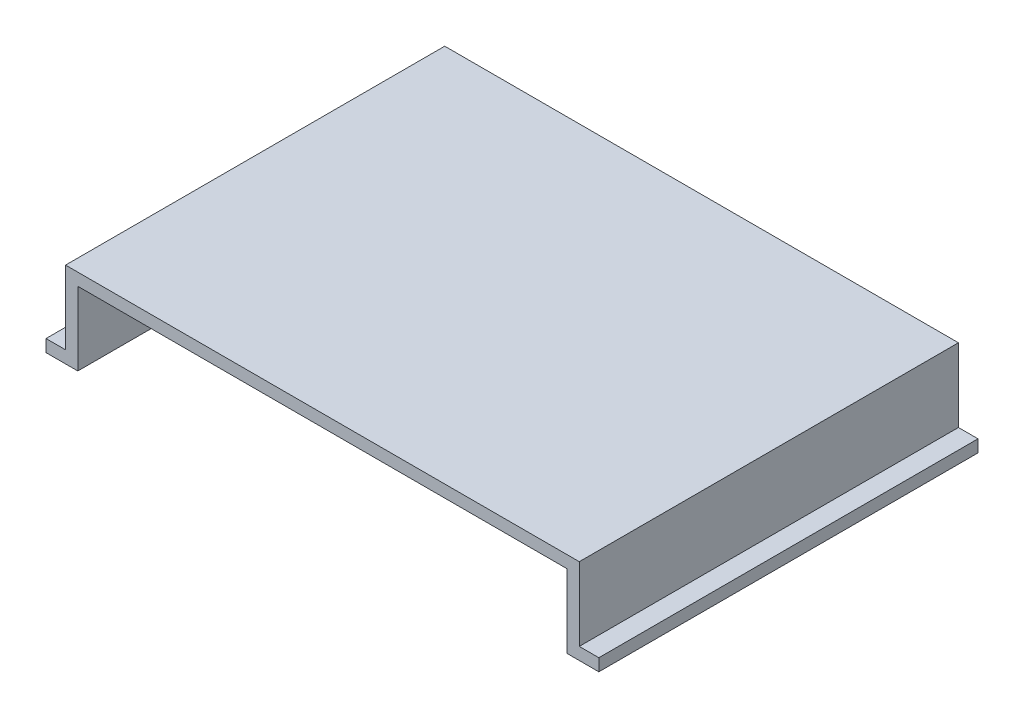
ISO-10303-21;
HEADER;
FILE_DESCRIPTION(('STEP AP214'),'2;1');
FILE_NAME('part.step','',(''),(''),'','','');
FILE_SCHEMA(('AUTOMOTIVE_DESIGN { 1 0 10303 214 1 1 1 1 }'));
ENDSEC;
DATA;
#1=APPLICATION_CONTEXT('core data for automotive mechanical design processes');
#2=APPLICATION_PROTOCOL_DEFINITION('international standard','automotive_design',2000,#1);
#3=PRODUCT_CONTEXT('',#1,'mechanical');
#4=PRODUCT('Part','Part','',(#3));
#5=PRODUCT_RELATED_PRODUCT_CATEGORY('part','',(#4));
#6=PRODUCT_DEFINITION_FORMATION('','',#4);
#7=PRODUCT_DEFINITION_CONTEXT('part definition',#1,'design');
#8=PRODUCT_DEFINITION('design','',#6,#7);
#9=PRODUCT_DEFINITION_SHAPE('','',#8);
#10=(LENGTH_UNIT() NAMED_UNIT(*) SI_UNIT(.MILLI.,.METRE.));
#11=(NAMED_UNIT(*) PLANE_ANGLE_UNIT() SI_UNIT($,.RADIAN.));
#12=(NAMED_UNIT(*) SI_UNIT($,.STERADIAN.) SOLID_ANGLE_UNIT());
#13=UNCERTAINTY_MEASURE_WITH_UNIT(LENGTH_MEASURE(1.E-05),#10,'distance_accuracy_value','');
#14=(GEOMETRIC_REPRESENTATION_CONTEXT(3) GLOBAL_UNCERTAINTY_ASSIGNED_CONTEXT((#13)) GLOBAL_UNIT_ASSIGNED_CONTEXT((#10,
#11,#12)) REPRESENTATION_CONTEXT('',''));
#15=CARTESIAN_POINT('',(0.,0.,0.));
#16=DIRECTION('',(0.,0.,1.));
#17=DIRECTION('',(1.,0.,0.));
#18=AXIS2_PLACEMENT_3D('',#15,#16,#17);
#19=CARTESIAN_POINT('',(0.,5.,150.));
#20=DIRECTION('',(0.,0.,-1.));
#21=DIRECTION('',(-1.,0.,0.));
#22=AXIS2_PLACEMENT_3D('',#19,#20,#21);
#23=PLANE('',#22);
#24=DIRECTION('',(1.,0.,0.));
#25=VECTOR('',#24,1.);
#26=CARTESIAN_POINT('',(0.,0.,150.));
#27=LINE('',#26,#25);
#28=CARTESIAN_POINT('',(0.,0.,150.));
#29=VERTEX_POINT('',#28);
#30=CARTESIAN_POINT('',(200.,0.,150.));
#31=VERTEX_POINT('',#30);
#32=EDGE_CURVE('E257',#29,#31,#27,.T.);
#33=ORIENTED_EDGE('',*,*,#32,.T.);
#34=DIRECTION('',(0.,1.,0.));
#35=VECTOR('',#34,1.);
#36=CARTESIAN_POINT('',(200.,-30.,150.));
#37=LINE('',#36,#35);
#38=CARTESIAN_POINT('',(200.,-30.,150.));
#39=VERTEX_POINT('',#38);
#40=EDGE_CURVE('E243',#39,#31,#37,.T.);
#41=ORIENTED_EDGE('',*,*,#40,.F.);
#42=DIRECTION('',(1.,0.,0.));
#43=VECTOR('',#42,1.);
#44=CARTESIAN_POINT('',(200.,-30.,150.));
#45=LINE('',#44,#43);
#46=CARTESIAN_POINT('',(213.,-30.,150.));
#47=VERTEX_POINT('',#46);
#48=EDGE_CURVE('E143',#39,#47,#45,.T.);
#49=ORIENTED_EDGE('',*,*,#48,.T.);
#50=DIRECTION('',(0.,-1.,0.));
#51=VECTOR('',#50,1.);
#52=CARTESIAN_POINT('',(213.,-30.,150.));
#53=LINE('',#52,#51);
#54=CARTESIAN_POINT('',(213.,-25.,150.));
#55=VERTEX_POINT('',#54);
#56=EDGE_CURVE('E175',#55,#47,#53,.T.);
#57=ORIENTED_EDGE('',*,*,#56,.F.);
#58=DIRECTION('',(-1.,0.,0.));
#59=VECTOR('',#58,1.);
#60=CARTESIAN_POINT('',(213.,-25.,150.));
#61=LINE('',#60,#59);
#62=CARTESIAN_POINT('',(205.,-25.,150.));
#63=VERTEX_POINT('',#62);
#64=EDGE_CURVE('E187',#55,#63,#61,.T.);
#65=ORIENTED_EDGE('',*,*,#64,.T.);
#66=DIRECTION('',(0.,1.,0.));
#67=VECTOR('',#66,1.);
#68=CARTESIAN_POINT('',(205.,-30.,150.));
#69=LINE('',#68,#67);
#70=CARTESIAN_POINT('',(205.,5.,150.));
#71=VERTEX_POINT('',#70);
#72=EDGE_CURVE('E240',#63,#71,#69,.T.);
#73=ORIENTED_EDGE('',*,*,#72,.T.);
#74=DIRECTION('',(1.,0.,0.));
#75=VECTOR('',#74,1.);
#76=CARTESIAN_POINT('',(0.,5.,150.));
#77=LINE('',#76,#75);
#78=CARTESIAN_POINT('',(-5.,5.,150.));
#79=VERTEX_POINT('',#78);
#80=EDGE_CURVE('E11',#79,#71,#77,.T.);
#81=ORIENTED_EDGE('',*,*,#80,.F.);
#82=DIRECTION('',(0.,1.,0.));
#83=VECTOR('',#82,1.);
#84=CARTESIAN_POINT('',(-5.,-30.,150.));
#85=LINE('',#84,#83);
#86=CARTESIAN_POINT('',(-5.,-25.,150.));
#87=VERTEX_POINT('',#86);
#88=EDGE_CURVE('E231',#87,#79,#85,.T.);
#89=ORIENTED_EDGE('',*,*,#88,.F.);
#90=DIRECTION('',(1.,0.,0.));
#91=VECTOR('',#90,1.);
#92=CARTESIAN_POINT('',(-13.,-25.,150.));
#93=LINE('',#92,#91);
#94=CARTESIAN_POINT('',(-13.,-25.,150.));
#95=VERTEX_POINT('',#94);
#96=EDGE_CURVE('E171',#95,#87,#93,.T.);
#97=ORIENTED_EDGE('',*,*,#96,.F.);
#98=DIRECTION('',(0.,1.,0.));
#99=VECTOR('',#98,1.);
#100=CARTESIAN_POINT('',(-13.,-30.,150.));
#101=LINE('',#100,#99);
#102=CARTESIAN_POINT('',(-13.,-30.,150.));
#103=VERTEX_POINT('',#102);
#104=EDGE_CURVE('E153',#103,#95,#101,.T.);
#105=ORIENTED_EDGE('',*,*,#104,.F.);
#106=DIRECTION('',(1.,0.,0.));
#107=VECTOR('',#106,1.);
#108=CARTESIAN_POINT('',(0.,-30.,150.));
#109=LINE('',#108,#107);
#110=CARTESIAN_POINT('',(0.,-30.,150.));
#111=VERTEX_POINT('',#110);
#112=EDGE_CURVE('E142',#103,#111,#109,.T.);
#113=ORIENTED_EDGE('',*,*,#112,.T.);
#114=DIRECTION('',(0.,1.,0.));
#115=VECTOR('',#114,1.);
#116=CARTESIAN_POINT('',(0.,-30.,150.));
#117=LINE('',#116,#115);
#118=EDGE_CURVE('E226',#111,#29,#117,.T.);
#119=ORIENTED_EDGE('',*,*,#118,.T.);
#120=EDGE_LOOP('',(#33,#41,#49,#57,#65,#73,#81,#89,#97,#105,#113,#119));
#121=FACE_BOUND('',#120,.T.);
#122=ADVANCED_FACE('F39',(#121),#23,.F.);
#123=CARTESIAN_POINT('',(0.,5.,0.));
#124=DIRECTION('',(0.,1.,0.));
#125=DIRECTION('',(0.,0.,1.));
#126=AXIS2_PLACEMENT_3D('',#123,#124,#125);
#127=PLANE('',#126);
#128=DIRECTION('',(0.,0.,1.));
#129=VECTOR('',#128,1.);
#130=CARTESIAN_POINT('',(-5.,5.,150.));
#131=LINE('',#130,#129);
#132=CARTESIAN_POINT('',(-5.,5.,-5.));
#133=VERTEX_POINT('',#132);
#134=EDGE_CURVE('E203',#133,#79,#131,.T.);
#135=ORIENTED_EDGE('',*,*,#134,.T.);
#136=ORIENTED_EDGE('',*,*,#80,.T.);
#137=DIRECTION('',(0.,0.,-1.));
#138=VECTOR('',#137,1.);
#139=CARTESIAN_POINT('',(205.,5.,0.));
#140=LINE('',#139,#138);
#141=CARTESIAN_POINT('',(205.,5.,-5.));
#142=VERTEX_POINT('',#141);
#143=EDGE_CURVE('E197',#71,#142,#140,.T.);
#144=ORIENTED_EDGE('',*,*,#143,.T.);
#145=DIRECTION('',(-1.,0.,0.));
#146=VECTOR('',#145,1.);
#147=CARTESIAN_POINT('',(-5.,5.,-5.));
#148=LINE('',#147,#146);
#149=EDGE_CURVE('E219',#142,#133,#148,.T.);
#150=ORIENTED_EDGE('',*,*,#149,.T.);
#151=EDGE_LOOP('',(#135,#136,#144,#150));
#152=FACE_BOUND('',#151,.T.);
#153=ADVANCED_FACE('F281',(#152),#127,.T.);
#154=CARTESIAN_POINT('',(0.,0.,0.));
#155=DIRECTION('',(0.,1.,0.));
#156=DIRECTION('',(0.,0.,1.));
#157=AXIS2_PLACEMENT_3D('',#154,#155,#156);
#158=PLANE('',#157);
#159=DIRECTION('',(0.,0.,1.));
#160=VECTOR('',#159,1.);
#161=CARTESIAN_POINT('',(0.,0.,0.));
#162=LINE('',#161,#160);
#163=CARTESIAN_POINT('',(0.,0.,0.));
#164=VERTEX_POINT('',#163);
#165=EDGE_CURVE('E230',#164,#29,#162,.T.);
#166=ORIENTED_EDGE('',*,*,#165,.F.);
#167=DIRECTION('',(-1.,0.,0.));
#168=VECTOR('',#167,1.);
#169=CARTESIAN_POINT('',(0.,0.,0.));
#170=LINE('',#169,#168);
#171=CARTESIAN_POINT('',(200.,0.,0.));
#172=VERTEX_POINT('',#171);
#173=EDGE_CURVE('E42',#172,#164,#170,.T.);
#174=ORIENTED_EDGE('',*,*,#173,.F.);
#175=DIRECTION('',(0.,0.,-1.));
#176=VECTOR('',#175,1.);
#177=CARTESIAN_POINT('',(200.,0.,0.));
#178=LINE('',#177,#176);
#179=EDGE_CURVE('E259',#31,#172,#178,.T.);
#180=ORIENTED_EDGE('',*,*,#179,.F.);
#181=ORIENTED_EDGE('',*,*,#32,.F.);
#182=EDGE_LOOP('',(#166,#174,#180,#181));
#183=FACE_BOUND('',#182,.T.);
#184=ADVANCED_FACE('F293',(#183),#158,.F.);
#185=CARTESIAN_POINT('',(0.,-30.,150.));
#186=DIRECTION('',(1.,0.,0.));
#187=DIRECTION('',(0.,0.,-1.));
#188=AXIS2_PLACEMENT_3D('',#185,#186,#187);
#189=PLANE('',#188);
#190=ORIENTED_EDGE('',*,*,#165,.T.);
#191=ORIENTED_EDGE('',*,*,#118,.F.);
#192=DIRECTION('',(0.,0.,-1.));
#193=VECTOR('',#192,1.);
#194=CARTESIAN_POINT('',(0.,-30.,150.));
#195=LINE('',#194,#193);
#196=CARTESIAN_POINT('',(0.,-30.,0.));
#197=VERTEX_POINT('',#196);
#198=EDGE_CURVE('E198',#111,#197,#195,.T.);
#199=ORIENTED_EDGE('',*,*,#198,.T.);
#200=DIRECTION('',(0.,1.,0.));
#201=VECTOR('',#200,1.);
#202=CARTESIAN_POINT('',(0.,-30.,0.));
#203=LINE('',#202,#201);
#204=EDGE_CURVE('E215',#197,#164,#203,.T.);
#205=ORIENTED_EDGE('',*,*,#204,.T.);
#206=EDGE_LOOP('',(#190,#191,#199,#205));
#207=FACE_BOUND('',#206,.T.);
#208=ADVANCED_FACE('F271',(#207),#189,.T.);
#209=CARTESIAN_POINT('',(200.,-30.,150.));
#210=DIRECTION('',(-1.,0.,0.));
#211=DIRECTION('',(0.,0.,1.));
#212=AXIS2_PLACEMENT_3D('',#209,#210,#211);
#213=PLANE('',#212);
#214=ORIENTED_EDGE('',*,*,#179,.T.);
#215=DIRECTION('',(0.,1.,0.));
#216=VECTOR('',#215,1.);
#217=CARTESIAN_POINT('',(200.,-30.,0.));
#218=LINE('',#217,#216);
#219=CARTESIAN_POINT('',(200.,-30.,0.));
#220=VERTEX_POINT('',#219);
#221=EDGE_CURVE('E247',#220,#172,#218,.T.);
#222=ORIENTED_EDGE('',*,*,#221,.F.);
#223=DIRECTION('',(0.,0.,1.));
#224=VECTOR('',#223,1.);
#225=CARTESIAN_POINT('',(200.,-30.,150.));
#226=LINE('',#225,#224);
#227=EDGE_CURVE('E207',#220,#39,#226,.T.);
#228=ORIENTED_EDGE('',*,*,#227,.T.);
#229=ORIENTED_EDGE('',*,*,#40,.T.);
#230=EDGE_LOOP('',(#214,#222,#228,#229));
#231=FACE_BOUND('',#230,.T.);
#232=ADVANCED_FACE('F292',(#231),#213,.T.);
#233=CARTESIAN_POINT('',(0.,-30.,0.));
#234=DIRECTION('',(0.,0.,1.));
#235=DIRECTION('',(1.,0.,0.));
#236=AXIS2_PLACEMENT_3D('',#233,#234,#235);
#237=PLANE('',#236);
#238=ORIENTED_EDGE('',*,*,#173,.T.);
#239=ORIENTED_EDGE('',*,*,#204,.F.);
#240=DIRECTION('',(1.,0.,0.));
#241=VECTOR('',#240,1.);
#242=CARTESIAN_POINT('',(0.,-30.,0.));
#243=LINE('',#242,#241);
#244=EDGE_CURVE('E202',#197,#220,#243,.T.);
#245=ORIENTED_EDGE('',*,*,#244,.T.);
#246=ORIENTED_EDGE('',*,*,#221,.T.);
#247=EDGE_LOOP('',(#238,#239,#245,#246));
#248=FACE_BOUND('',#247,.T.);
#249=ADVANCED_FACE('F267',(#248),#237,.T.);
#250=CARTESIAN_POINT('',(-5.,-30.,150.));
#251=DIRECTION('',(-1.,0.,0.));
#252=DIRECTION('',(0.,0.,1.));
#253=AXIS2_PLACEMENT_3D('',#250,#251,#252);
#254=PLANE('',#253);
#255=DIRECTION('',(0.,0.,-1.));
#256=VECTOR('',#255,1.);
#257=CARTESIAN_POINT('',(-5.,-25.,-5.));
#258=LINE('',#257,#256);
#259=CARTESIAN_POINT('',(-5.,-25.,-5.));
#260=VERTEX_POINT('',#259);
#261=EDGE_CURVE('E55',#87,#260,#258,.T.);
#262=ORIENTED_EDGE('',*,*,#261,.F.);
#263=ORIENTED_EDGE('',*,*,#88,.T.);
#264=ORIENTED_EDGE('',*,*,#134,.F.);
#265=DIRECTION('',(0.,1.,0.));
#266=VECTOR('',#265,1.);
#267=CARTESIAN_POINT('',(-5.,-30.,-5.));
#268=LINE('',#267,#266);
#269=EDGE_CURVE('E234',#260,#133,#268,.T.);
#270=ORIENTED_EDGE('',*,*,#269,.F.);
#271=EDGE_LOOP('',(#262,#263,#264,#270));
#272=FACE_BOUND('',#271,.T.);
#273=ADVANCED_FACE('F279',(#272),#254,.T.);
#274=CARTESIAN_POINT('',(-5.,-30.,-5.));
#275=DIRECTION('',(0.,0.,-1.));
#276=DIRECTION('',(-1.,0.,0.));
#277=AXIS2_PLACEMENT_3D('',#274,#275,#276);
#278=PLANE('',#277);
#279=ORIENTED_EDGE('',*,*,#149,.F.);
#280=DIRECTION('',(0.,1.,0.));
#281=VECTOR('',#280,1.);
#282=CARTESIAN_POINT('',(205.,-30.,-5.));
#283=LINE('',#282,#281);
#284=CARTESIAN_POINT('',(205.,-25.,-5.));
#285=VERTEX_POINT('',#284);
#286=EDGE_CURVE('E237',#285,#142,#283,.T.);
#287=ORIENTED_EDGE('',*,*,#286,.F.);
#288=DIRECTION('',(-1.,0.,0.));
#289=VECTOR('',#288,1.);
#290=CARTESIAN_POINT('',(213.,-25.,-5.));
#291=LINE('',#290,#289);
#292=CARTESIAN_POINT('',(213.,-25.,-5.));
#293=VERTEX_POINT('',#292);
#294=EDGE_CURVE('E193',#293,#285,#291,.T.);
#295=ORIENTED_EDGE('',*,*,#294,.F.);
#296=DIRECTION('',(0.,1.,0.));
#297=VECTOR('',#296,1.);
#298=CARTESIAN_POINT('',(213.,-30.,-5.));
#299=LINE('',#298,#297);
#300=CARTESIAN_POINT('',(213.,-30.,-5.));
#301=VERTEX_POINT('',#300);
#302=EDGE_CURVE('E137',#301,#293,#299,.T.);
#303=ORIENTED_EDGE('',*,*,#302,.F.);
#304=DIRECTION('',(-1.,0.,0.));
#305=VECTOR('',#304,1.);
#306=CARTESIAN_POINT('',(-5.,-30.,-5.));
#307=LINE('',#306,#305);
#308=CARTESIAN_POINT('',(-13.,-30.,-5.));
#309=VERTEX_POINT('',#308);
#310=EDGE_CURVE('E129',#301,#309,#307,.T.);
#311=ORIENTED_EDGE('',*,*,#310,.T.);
#312=DIRECTION('',(0.,-1.,0.));
#313=VECTOR('',#312,1.);
#314=CARTESIAN_POINT('',(-13.,-30.,-5.));
#315=LINE('',#314,#313);
#316=CARTESIAN_POINT('',(-13.,-25.,-5.));
#317=VERTEX_POINT('',#316);
#318=EDGE_CURVE('E135',#317,#309,#315,.T.);
#319=ORIENTED_EDGE('',*,*,#318,.F.);
#320=DIRECTION('',(1.,0.,0.));
#321=VECTOR('',#320,1.);
#322=CARTESIAN_POINT('',(-13.,-25.,-5.));
#323=LINE('',#322,#321);
#324=EDGE_CURVE('E167',#317,#260,#323,.T.);
#325=ORIENTED_EDGE('',*,*,#324,.T.);
#326=ORIENTED_EDGE('',*,*,#269,.T.);
#327=EDGE_LOOP('',(#279,#287,#295,#303,#311,#319,#325,#326));
#328=FACE_BOUND('',#327,.T.);
#329=ADVANCED_FACE('F132',(#328),#278,.T.);
#330=CARTESIAN_POINT('',(205.,-30.,0.));
#331=DIRECTION('',(1.,0.,0.));
#332=DIRECTION('',(0.,0.,-1.));
#333=AXIS2_PLACEMENT_3D('',#330,#331,#332);
#334=PLANE('',#333);
#335=DIRECTION('',(0.,0.,1.));
#336=VECTOR('',#335,1.);
#337=CARTESIAN_POINT('',(205.,-25.,150.));
#338=LINE('',#337,#336);
#339=EDGE_CURVE('E63',#285,#63,#338,.T.);
#340=ORIENTED_EDGE('',*,*,#339,.F.);
#341=ORIENTED_EDGE('',*,*,#286,.T.);
#342=ORIENTED_EDGE('',*,*,#143,.F.);
#343=ORIENTED_EDGE('',*,*,#72,.F.);
#344=EDGE_LOOP('',(#340,#341,#342,#343));
#345=FACE_BOUND('',#344,.T.);
#346=ADVANCED_FACE('F283',(#345),#334,.T.);
#347=CARTESIAN_POINT('',(0.,-30.,0.));
#348=DIRECTION('',(0.,-1.,0.));
#349=DIRECTION('',(0.,0.,-1.));
#350=AXIS2_PLACEMENT_3D('',#347,#348,#349);
#351=PLANE('',#350);
#352=ORIENTED_EDGE('',*,*,#198,.F.);
#353=ORIENTED_EDGE('',*,*,#112,.F.);
#354=DIRECTION('',(0.,0.,1.));
#355=VECTOR('',#354,1.);
#356=CARTESIAN_POINT('',(-13.,-30.,-5.));
#357=LINE('',#356,#355);
#358=EDGE_CURVE('E146',#309,#103,#357,.T.);
#359=ORIENTED_EDGE('',*,*,#358,.F.);
#360=ORIENTED_EDGE('',*,*,#310,.F.);
#361=DIRECTION('',(0.,0.,-1.));
#362=VECTOR('',#361,1.);
#363=CARTESIAN_POINT('',(213.,-30.,150.));
#364=LINE('',#363,#362);
#365=EDGE_CURVE('E179',#47,#301,#364,.T.);
#366=ORIENTED_EDGE('',*,*,#365,.F.);
#367=ORIENTED_EDGE('',*,*,#48,.F.);
#368=ORIENTED_EDGE('',*,*,#227,.F.);
#369=ORIENTED_EDGE('',*,*,#244,.F.);
#370=EDGE_LOOP('',(#352,#353,#359,#360,#366,#367,#368,#369));
#371=FACE_BOUND('',#370,.T.);
#372=ADVANCED_FACE('F148',(#371),#351,.T.);
#373=CARTESIAN_POINT('',(213.,-25.,150.));
#374=DIRECTION('',(0.,-1.,0.));
#375=DIRECTION('',(0.,0.,-1.));
#376=AXIS2_PLACEMENT_3D('',#373,#374,#375);
#377=PLANE('',#376);
#378=ORIENTED_EDGE('',*,*,#339,.T.);
#379=ORIENTED_EDGE('',*,*,#64,.F.);
#380=DIRECTION('',(0.,0.,1.));
#381=VECTOR('',#380,1.);
#382=CARTESIAN_POINT('',(213.,-25.,150.));
#383=LINE('',#382,#381);
#384=EDGE_CURVE('E184',#293,#55,#383,.T.);
#385=ORIENTED_EDGE('',*,*,#384,.F.);
#386=ORIENTED_EDGE('',*,*,#294,.T.);
#387=EDGE_LOOP('',(#378,#379,#385,#386));
#388=FACE_BOUND('',#387,.T.);
#389=ADVANCED_FACE('F286',(#388),#377,.F.);
#390=CARTESIAN_POINT('',(213.,0.,0.));
#391=DIRECTION('',(-1.,0.,0.));
#392=DIRECTION('',(0.,0.,1.));
#393=AXIS2_PLACEMENT_3D('',#390,#391,#392);
#394=PLANE('',#393);
#395=ORIENTED_EDGE('',*,*,#56,.T.);
#396=ORIENTED_EDGE('',*,*,#365,.T.);
#397=ORIENTED_EDGE('',*,*,#302,.T.);
#398=ORIENTED_EDGE('',*,*,#384,.T.);
#399=EDGE_LOOP('',(#395,#396,#397,#398));
#400=FACE_BOUND('',#399,.T.);
#401=ADVANCED_FACE('F290',(#400),#394,.F.);
#402=CARTESIAN_POINT('',(-13.,-25.,-5.));
#403=DIRECTION('',(0.,-1.,0.));
#404=DIRECTION('',(0.,0.,-1.));
#405=AXIS2_PLACEMENT_3D('',#402,#403,#404);
#406=PLANE('',#405);
#407=ORIENTED_EDGE('',*,*,#261,.T.);
#408=ORIENTED_EDGE('',*,*,#324,.F.);
#409=DIRECTION('',(0.,0.,-1.));
#410=VECTOR('',#409,1.);
#411=CARTESIAN_POINT('',(-13.,-25.,-5.));
#412=LINE('',#411,#410);
#413=EDGE_CURVE('E157',#95,#317,#412,.T.);
#414=ORIENTED_EDGE('',*,*,#413,.F.);
#415=ORIENTED_EDGE('',*,*,#96,.T.);
#416=EDGE_LOOP('',(#407,#408,#414,#415));
#417=FACE_BOUND('',#416,.T.);
#418=ADVANCED_FACE('F277',(#417),#406,.F.);
#419=CARTESIAN_POINT('',(-13.,0.,0.));
#420=DIRECTION('',(1.,0.,0.));
#421=DIRECTION('',(0.,0.,-1.));
#422=AXIS2_PLACEMENT_3D('',#419,#420,#421);
#423=PLANE('',#422);
#424=ORIENTED_EDGE('',*,*,#318,.T.);
#425=ORIENTED_EDGE('',*,*,#358,.T.);
#426=ORIENTED_EDGE('',*,*,#104,.T.);
#427=ORIENTED_EDGE('',*,*,#413,.T.);
#428=EDGE_LOOP('',(#424,#425,#426,#427));
#429=FACE_BOUND('',#428,.T.);
#430=ADVANCED_FACE('F155',(#429),#423,.F.);
#431=CLOSED_SHELL('',(#122,#153,#184,#208,#232,#249,#273,#329,#346,#372,#389,#401,#418,#430));
#432=MANIFOLD_SOLID_BREP('B2',#431);
#433=ADVANCED_BREP_SHAPE_REPRESENTATION('',(#18,#432),#14);
#434=SHAPE_DEFINITION_REPRESENTATION(#9,#433);
ENDSEC;
END-ISO-10303-21;
